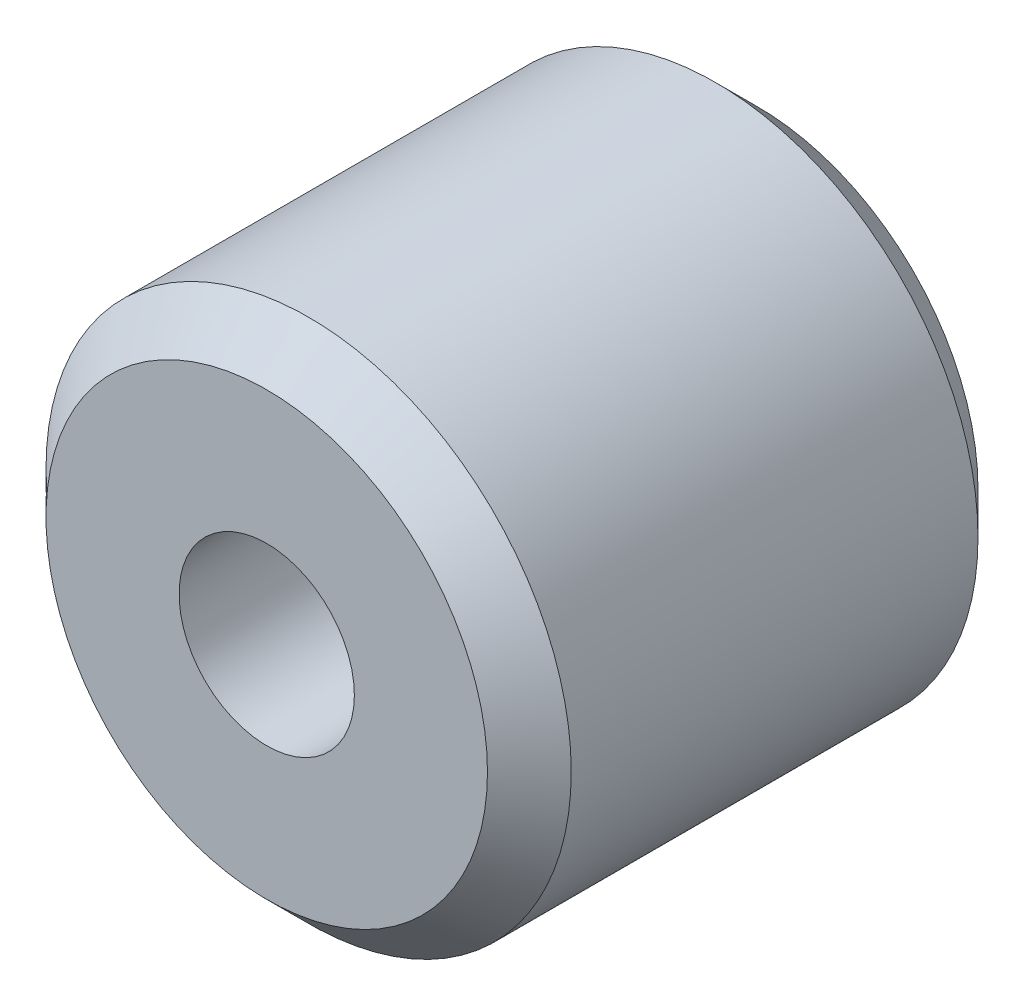
ISO-10303-21;
HEADER;
FILE_DESCRIPTION(('STEP AP214'),'2;1');
FILE_NAME('part.step','',(''),(''),'','','');
FILE_SCHEMA(('AUTOMOTIVE_DESIGN { 1 0 10303 214 1 1 1 1 }'));
ENDSEC;
DATA;
#1=APPLICATION_CONTEXT('core data for automotive mechanical design processes');
#2=APPLICATION_PROTOCOL_DEFINITION('international standard','automotive_design',2000,#1);
#3=PRODUCT_CONTEXT('',#1,'mechanical');
#4=PRODUCT('Part','Part','',(#3));
#5=PRODUCT_RELATED_PRODUCT_CATEGORY('part','',(#4));
#6=PRODUCT_DEFINITION_FORMATION('','',#4);
#7=PRODUCT_DEFINITION_CONTEXT('part definition',#1,'design');
#8=PRODUCT_DEFINITION('design','',#6,#7);
#9=PRODUCT_DEFINITION_SHAPE('','',#8);
#10=(LENGTH_UNIT() NAMED_UNIT(*) SI_UNIT(.MILLI.,.METRE.));
#11=(NAMED_UNIT(*) PLANE_ANGLE_UNIT() SI_UNIT($,.RADIAN.));
#12=(NAMED_UNIT(*) SI_UNIT($,.STERADIAN.) SOLID_ANGLE_UNIT());
#13=UNCERTAINTY_MEASURE_WITH_UNIT(LENGTH_MEASURE(1.E-05),#10,'distance_accuracy_value','');
#14=(GEOMETRIC_REPRESENTATION_CONTEXT(3) GLOBAL_UNCERTAINTY_ASSIGNED_CONTEXT((#13)) GLOBAL_UNIT_ASSIGNED_CONTEXT((#10,
#11,#12)) REPRESENTATION_CONTEXT('',''));
#15=CARTESIAN_POINT('',(0.,0.,0.));
#16=DIRECTION('',(0.,0.,1.));
#17=DIRECTION('',(1.,0.,0.));
#18=AXIS2_PLACEMENT_3D('',#15,#16,#17);
#19=CARTESIAN_POINT('',(0.,0.,4.45));
#20=DIRECTION('',(0.,0.,1.));
#21=DIRECTION('',(1.,0.,0.));
#22=AXIS2_PLACEMENT_3D('',#19,#20,#21);
#23=PLANE('',#22);
#24=CARTESIAN_POINT('',(0.,0.,4.45));
#25=DIRECTION('',(0.,0.,1.));
#26=DIRECTION('',(1.,0.,0.));
#27=AXIS2_PLACEMENT_3D('',#24,#25,#26);
#28=CIRCLE('',#27,4.005);
#29=CARTESIAN_POINT('',(4.005,0.,4.45));
#30=VERTEX_POINT('',#29);
#31=EDGE_CURVE('E10',#30,#30,#28,.T.);
#32=ORIENTED_EDGE('',*,*,#31,.T.);
#33=EDGE_LOOP('',(#32));
#34=FACE_BOUND('',#33,.T.);
#35=CARTESIAN_POINT('',(0.,0.,4.45));
#36=DIRECTION('',(0.,0.,1.));
#37=DIRECTION('',(1.,0.,0.));
#38=AXIS2_PLACEMENT_3D('',#35,#36,#37);
#39=CIRCLE('',#38,1.59);
#40=CARTESIAN_POINT('',(1.59,0.,4.45));
#41=VERTEX_POINT('',#40);
#42=EDGE_CURVE('E67',#41,#41,#39,.T.);
#43=ORIENTED_EDGE('',*,*,#42,.F.);
#44=EDGE_LOOP('',(#43));
#45=FACE_BOUND('',#44,.T.);
#46=ADVANCED_FACE('F42',(#34,#45),#23,.T.);
#47=CARTESIAN_POINT('',(0.,0.,-4.45));
#48=DIRECTION('',(0.,0.,1.));
#49=DIRECTION('',(1.,0.,0.));
#50=AXIS2_PLACEMENT_3D('',#47,#48,#49);
#51=PLANE('',#50);
#52=CARTESIAN_POINT('',(0.,0.,-4.45));
#53=DIRECTION('',(0.,0.,1.));
#54=DIRECTION('',(1.,0.,0.));
#55=AXIS2_PLACEMENT_3D('',#52,#53,#54);
#56=CIRCLE('',#55,4.00499999999999);
#57=CARTESIAN_POINT('',(4.00499999999999,0.,-4.45));
#58=VERTEX_POINT('',#57);
#59=EDGE_CURVE('E51',#58,#58,#56,.F.);
#60=ORIENTED_EDGE('',*,*,#59,.T.);
#61=EDGE_LOOP('',(#60));
#62=FACE_BOUND('',#61,.T.);
#63=CARTESIAN_POINT('',(0.,0.,-4.45));
#64=DIRECTION('',(0.,0.,1.));
#65=DIRECTION('',(1.,0.,0.));
#66=AXIS2_PLACEMENT_3D('',#63,#64,#65);
#67=CIRCLE('',#66,1.59);
#68=CARTESIAN_POINT('',(1.59,0.,-4.45));
#69=VERTEX_POINT('',#68);
#70=EDGE_CURVE('E68',#69,#69,#67,.T.);
#71=ORIENTED_EDGE('',*,*,#70,.T.);
#72=EDGE_LOOP('',(#71));
#73=FACE_BOUND('',#72,.T.);
#74=ADVANCED_FACE('F80',(#62,#73),#51,.F.);
#75=CARTESIAN_POINT('',(0.,0.,4.45));
#76=DIRECTION('',(0.,0.,-1.));
#77=DIRECTION('',(-1.,0.,0.));
#78=AXIS2_PLACEMENT_3D('',#75,#76,#77);
#79=CYLINDRICAL_SURFACE('',#78,4.765);
#80=CARTESIAN_POINT('',(0.,0.,-3.69));
#81=DIRECTION('',(0.,0.,1.));
#82=DIRECTION('',(1.,0.,0.));
#83=AXIS2_PLACEMENT_3D('',#80,#81,#82);
#84=CIRCLE('',#83,4.765);
#85=CARTESIAN_POINT('',(4.765,0.,-3.69));
#86=VERTEX_POINT('',#85);
#87=EDGE_CURVE('E56',#86,#86,#84,.T.);
#88=ORIENTED_EDGE('',*,*,#87,.T.);
#89=EDGE_LOOP('',(#88));
#90=FACE_BOUND('',#89,.T.);
#91=CARTESIAN_POINT('',(0.,0.,3.69));
#92=DIRECTION('',(0.,0.,1.));
#93=DIRECTION('',(1.,0.,0.));
#94=AXIS2_PLACEMENT_3D('',#91,#92,#93);
#95=CIRCLE('',#94,4.765);
#96=CARTESIAN_POINT('',(4.765,0.,3.69));
#97=VERTEX_POINT('',#96);
#98=EDGE_CURVE('E61',#97,#97,#95,.F.);
#99=ORIENTED_EDGE('',*,*,#98,.T.);
#100=EDGE_LOOP('',(#99));
#101=FACE_BOUND('',#100,.T.);
#102=ADVANCED_FACE('F85',(#90,#101),#79,.T.);
#103=CARTESIAN_POINT('',(0.,0.,4.45));
#104=DIRECTION('',(0.,0.,-1.));
#105=DIRECTION('',(-1.,0.,0.));
#106=AXIS2_PLACEMENT_3D('',#103,#104,#105);
#107=CYLINDRICAL_SURFACE('',#106,1.59);
#108=ORIENTED_EDGE('',*,*,#42,.T.);
#109=EDGE_LOOP('',(#108));
#110=FACE_BOUND('',#109,.T.);
#111=ORIENTED_EDGE('',*,*,#70,.F.);
#112=EDGE_LOOP('',(#111));
#113=FACE_BOUND('',#112,.T.);
#114=ADVANCED_FACE('F76',(#110,#113),#107,.F.);
#115=CARTESIAN_POINT('',(0.,0.,-3.69));
#116=DIRECTION('',(0.,0.,1.));
#117=DIRECTION('',(1.,0.,0.));
#118=AXIS2_PLACEMENT_3D('',#115,#116,#117);
#119=CONICAL_SURFACE('',#118,4.765,0.78539816339745);
#120=ORIENTED_EDGE('',*,*,#59,.F.);
#121=EDGE_LOOP('',(#120));
#122=FACE_BOUND('',#121,.T.);
#123=ORIENTED_EDGE('',*,*,#87,.F.);
#124=EDGE_LOOP('',(#123));
#125=FACE_BOUND('',#124,.T.);
#126=ADVANCED_FACE('F92',(#122,#125),#119,.T.);
#127=CARTESIAN_POINT('',(0.,0.,4.45));
#128=DIRECTION('',(0.,0.,-1.));
#129=DIRECTION('',(-1.,0.,0.));
#130=AXIS2_PLACEMENT_3D('',#127,#128,#129);
#131=CONICAL_SURFACE('',#130,4.005,0.785398163397447);
#132=ORIENTED_EDGE('',*,*,#98,.F.);
#133=EDGE_LOOP('',(#132));
#134=FACE_BOUND('',#133,.T.);
#135=ORIENTED_EDGE('',*,*,#31,.F.);
#136=EDGE_LOOP('',(#135));
#137=FACE_BOUND('',#136,.T.);
#138=ADVANCED_FACE('F45',(#134,#137),#131,.T.);
#139=CLOSED_SHELL('',(#46,#74,#102,#114,#126,#138));
#140=MANIFOLD_SOLID_BREP('B2',#139);
#141=ADVANCED_BREP_SHAPE_REPRESENTATION('',(#18,#140),#14);
#142=SHAPE_DEFINITION_REPRESENTATION(#9,#141);
ENDSEC;
END-ISO-10303-21;
